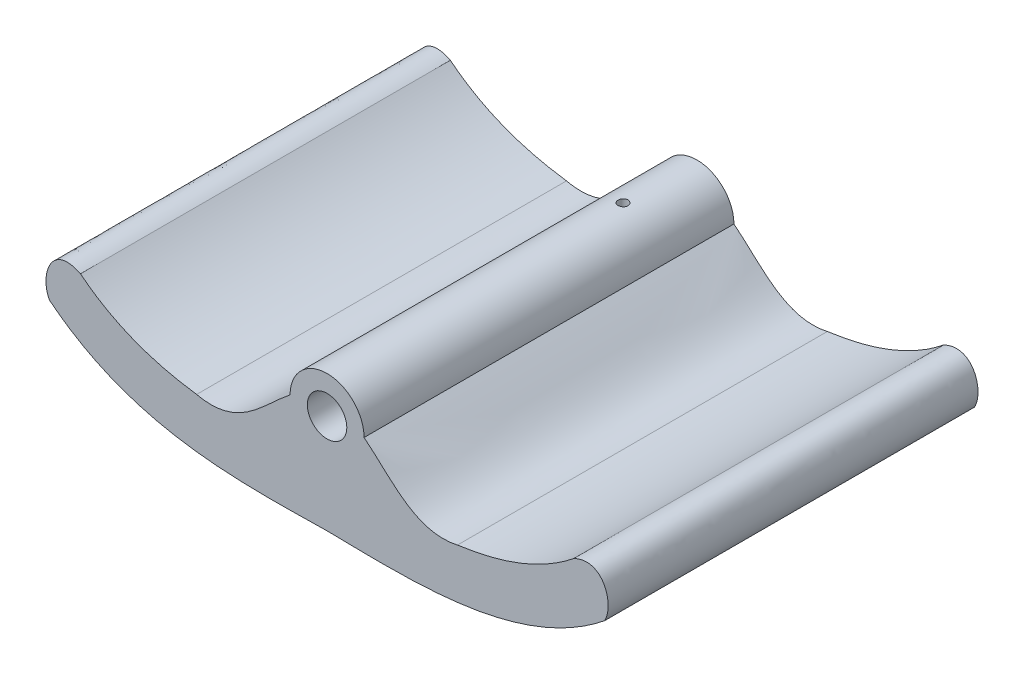
ISO-10303-21;
HEADER;
FILE_DESCRIPTION(('STEP AP214'),'2;1');
FILE_NAME('part.step','',(''),(''),'','','');
FILE_SCHEMA(('AUTOMOTIVE_DESIGN { 1 0 10303 214 1 1 1 1 }'));
ENDSEC;
DATA;
#1=APPLICATION_CONTEXT('core data for automotive mechanical design processes');
#2=APPLICATION_PROTOCOL_DEFINITION('international standard','automotive_design',2000,#1);
#3=PRODUCT_CONTEXT('',#1,'mechanical');
#4=PRODUCT('Part','Part','',(#3));
#5=PRODUCT_RELATED_PRODUCT_CATEGORY('part','',(#4));
#6=PRODUCT_DEFINITION_FORMATION('','',#4);
#7=PRODUCT_DEFINITION_CONTEXT('part definition',#1,'design');
#8=PRODUCT_DEFINITION('design','',#6,#7);
#9=PRODUCT_DEFINITION_SHAPE('','',#8);
#10=(LENGTH_UNIT() NAMED_UNIT(*) SI_UNIT(.MILLI.,.METRE.));
#11=(NAMED_UNIT(*) PLANE_ANGLE_UNIT() SI_UNIT($,.RADIAN.));
#12=(NAMED_UNIT(*) SI_UNIT($,.STERADIAN.) SOLID_ANGLE_UNIT());
#13=UNCERTAINTY_MEASURE_WITH_UNIT(LENGTH_MEASURE(1.E-05),#10,'distance_accuracy_value','');
#14=(GEOMETRIC_REPRESENTATION_CONTEXT(3) GLOBAL_UNCERTAINTY_ASSIGNED_CONTEXT((#13)) GLOBAL_UNIT_ASSIGNED_CONTEXT((#10,
#11,#12)) REPRESENTATION_CONTEXT('',''));
#15=CARTESIAN_POINT('',(0.,0.,0.));
#16=DIRECTION('',(0.,0.,1.));
#17=DIRECTION('',(1.,0.,0.));
#18=AXIS2_PLACEMENT_3D('',#15,#16,#17);
#19=CARTESIAN_POINT('',(0.,0.,75.));
#20=DIRECTION('',(0.,0.,-1.));
#21=DIRECTION('',(-1.,0.,0.));
#22=AXIS2_PLACEMENT_3D('',#19,#20,#21);
#23=CYLINDRICAL_SURFACE('',#22,7.5);
#24=CARTESIAN_POINT('',(0.,0.,0.));
#25=DIRECTION('',(0.,0.,1.));
#26=DIRECTION('',(1.,0.,0.));
#27=AXIS2_PLACEMENT_3D('',#24,#25,#26);
#28=CIRCLE('',#27,7.5);
#29=CARTESIAN_POINT('',(7.5,0.,0.));
#30=VERTEX_POINT('',#29);
#31=CARTESIAN_POINT('',(-7.5,0.,0.));
#32=VERTEX_POINT('',#31);
#33=EDGE_CURVE('E97',#30,#32,#28,.T.);
#34=ORIENTED_EDGE('',*,*,#33,.T.);
#35=DIRECTION('',(0.,0.,-1.));
#36=VECTOR('',#35,1.);
#37=CARTESIAN_POINT('',(-7.5,0.,75.));
#38=LINE('',#37,#36);
#39=CARTESIAN_POINT('',(-7.5,0.,75.));
#40=VERTEX_POINT('',#39);
#41=EDGE_CURVE('E260',#40,#32,#38,.T.);
#42=ORIENTED_EDGE('',*,*,#41,.F.);
#43=CARTESIAN_POINT('',(0.,0.,75.));
#44=DIRECTION('',(0.,0.,1.));
#45=DIRECTION('',(1.,0.,0.));
#46=AXIS2_PLACEMENT_3D('',#43,#44,#45);
#47=CIRCLE('',#46,7.5);
#48=CARTESIAN_POINT('',(7.5,0.,75.));
#49=VERTEX_POINT('',#48);
#50=EDGE_CURVE('E63',#49,#40,#47,.T.);
#51=ORIENTED_EDGE('',*,*,#50,.F.);
#52=DIRECTION('',(0.,0.,-1.));
#53=VECTOR('',#52,1.);
#54=CARTESIAN_POINT('',(7.5,0.,75.));
#55=LINE('',#54,#53);
#56=EDGE_CURVE('E94',#49,#30,#55,.T.);
#57=ORIENTED_EDGE('',*,*,#56,.T.);
#58=EDGE_LOOP('',(#34,#42,#51,#57));
#59=FACE_BOUND('',#58,.T.);
#60=CARTESIAN_POINT('',(0.,7.5,14.));
#61=CARTESIAN_POINT('',(-0.0559044178346404,7.49999917871272,14.0000023548535));
#62=CARTESIAN_POINT('',(-0.111842989638138,7.49936835363597,14.0047037689812));
#63=CARTESIAN_POINT('',(-0.222161362569038,7.49691255563452,14.0233831745248));
#64=CARTESIAN_POINT('',(-0.276539511166517,7.49508636220862,14.0373706474486));
#65=CARTESIAN_POINT('',(-0.38212415631349,7.49044539924533,14.0742008587707));
#66=CARTESIAN_POINT('',(-0.433332841529245,7.48763132105486,14.0970374055192));
#67=CARTESIAN_POINT('',(-0.531181947515148,7.48132693330196,14.1509034569031));
#68=CARTESIAN_POINT('',(-0.577823103168511,7.47783673279283,14.1819316405832));
#69=CARTESIAN_POINT('',(-0.665512911252337,7.47054497394982,14.2515066308021));
#70=CARTESIAN_POINT('',(-0.70652899274793,7.46674179081055,14.2900943225042));
#71=CARTESIAN_POINT('',(-0.781523678365507,7.45926568778975,14.3736050945383));
#72=CARTESIAN_POINT('',(-0.815501909986105,7.45559277481171,14.4185285099979));
#73=CARTESIAN_POINT('',(-0.875579511344536,7.44877717720095,14.5136495614725));
#74=CARTESIAN_POINT('',(-0.901648037412888,7.44563658882881,14.5638668412393));
#75=CARTESIAN_POINT('',(-0.944969225036449,7.44026293689616,14.6680155336184));
#76=CARTESIAN_POINT('',(-0.962222266226388,7.43802983425604,14.7219467861767));
#77=CARTESIAN_POINT('',(-0.987323033860868,7.43473968284334,14.8316529052508));
#78=CARTESIAN_POINT('',(-0.995226021142531,7.43367572685068,14.8874149172665));
#79=CARTESIAN_POINT('',(-1.00157340274058,7.43282325804657,14.999483089803));
#80=CARTESIAN_POINT('',(-1.000018228168,7.433034687102,15.0557892254054));
#81=CARTESIAN_POINT('',(-0.987538729696171,7.43470277886495,15.166960565014));
#82=CARTESIAN_POINT('',(-0.976675487658807,7.43615132311171,15.2218327649429));
#83=CARTESIAN_POINT('',(-0.945983623171856,7.44011776387373,15.32896841838));
#84=CARTESIAN_POINT('',(-0.926154796307285,7.44263568477064,15.3812318123775));
#85=CARTESIAN_POINT('',(-0.878029645715954,7.44846630555513,15.4818548173536));
#86=CARTESIAN_POINT('',(-0.849706989568744,7.45178147061949,15.5302016855972));
#87=CARTESIAN_POINT('',(-0.785416966721444,7.45883118109967,15.6214795409588));
#88=CARTESIAN_POINT('',(-0.749449202511923,7.46256574831765,15.6644102462771));
#89=CARTESIAN_POINT('',(-0.67055245013181,7.47006949616793,15.7439915062909));
#90=CARTESIAN_POINT('',(-0.62757085351322,7.47383871770599,15.7805899213512));
#91=CARTESIAN_POINT('',(-0.536047085066701,7.48095961909132,15.8460610224642));
#92=CARTESIAN_POINT('',(-0.487504897221182,7.48431129773577,15.8749336862618));
#93=CARTESIAN_POINT('',(-0.386196109865233,7.4902219687179,15.9241345588474));
#94=CARTESIAN_POINT('',(-0.333427789420613,7.49278063604478,15.9444592655232));
#95=CARTESIAN_POINT('',(-0.225185462168122,7.49681412952036,15.9759446594862));
#96=CARTESIAN_POINT('',(-0.169711599771125,7.49828901344964,15.9871058353197));
#97=CARTESIAN_POINT('',(-0.0580834516628186,7.49998120688428,15.9998792163856));
#98=CARTESIAN_POINT('',(-0.00193751727351819,7.50020796924523,16.0015632008917));
#99=CARTESIAN_POINT('',(0.109835808609361,7.49940395769259,15.9955241679364));
#100=CARTESIAN_POINT('',(0.165463212672835,7.49837321434299,15.9878013791088));
#101=CARTESIAN_POINT('',(0.274406857786472,7.4951758767905,15.963227673308));
#102=CARTESIAN_POINT('',(0.327731008256025,7.49301357151461,15.9464112158389));
#103=CARTESIAN_POINT('',(0.430802549396783,7.48779504627144,15.9041635170315));
#104=CARTESIAN_POINT('',(0.480549803507822,7.4847387921972,15.8787319469934));
#105=CARTESIAN_POINT('',(0.575374439308042,7.47804918685037,15.8198039222083));
#106=CARTESIAN_POINT('',(0.620422907198305,7.47441257522858,15.7862613171433));
#107=CARTESIAN_POINT('',(0.704276473495951,7.46697864354991,15.7121283353879));
#108=CARTESIAN_POINT('',(0.743081288311895,7.4631813162031,15.6715376387418));
#109=CARTESIAN_POINT('',(0.813602747115493,7.45582451236755,15.5841434286802));
#110=CARTESIAN_POINT('',(0.845271638044694,7.45226674387649,15.5373012166309));
#111=CARTESIAN_POINT('',(0.900291755394072,7.44582066500908,15.4389202948595));
#112=CARTESIAN_POINT('',(0.923643167551735,7.44293233968392,15.3873816900448));
#113=CARTESIAN_POINT('',(0.961289182503733,7.43816405890039,15.2812213789862));
#114=CARTESIAN_POINT('',(0.975610144233979,7.43628117116299,15.2266091573946));
#115=CARTESIAN_POINT('',(0.994873335719796,7.43372874349146,15.1157281839356));
#116=CARTESIAN_POINT('',(0.999816067133911,7.43305913865671,15.0594595208378));
#117=CARTESIAN_POINT('',(1.00017242903095,7.43301115647724,14.9473382545732));
#118=CARTESIAN_POINT('',(0.995661095972465,7.4336226114126,14.8914858795179));
#119=CARTESIAN_POINT('',(0.977396883433447,7.43604591937099,14.7813410624481));
#120=CARTESIAN_POINT('',(0.963644007416344,7.43785777194415,14.727048619849));
#121=CARTESIAN_POINT('',(0.927311551661037,7.44247445136382,14.6215781583742));
#122=CARTESIAN_POINT('',(0.904736104095207,7.445278813297,14.5703986944416));
#123=CARTESIAN_POINT('',(0.851406713798688,7.45156522856411,14.472542058087));
#124=CARTESIAN_POINT('',(0.820652613152144,7.45504729498301,14.425864972622));
#125=CARTESIAN_POINT('',(0.751562242547543,7.46232983591531,14.3379551750358));
#126=CARTESIAN_POINT('',(0.713170136134507,7.46613252877041,14.2967665261224));
#127=CARTESIAN_POINT('',(0.630010846749121,7.47360859500832,14.2213883918192));
#128=CARTESIAN_POINT('',(0.58524217036489,7.47728193784489,14.1872005506249));
#129=CARTESIAN_POINT('',(0.490376493926414,7.48410317568764,14.1266664307667));
#130=CARTESIAN_POINT('',(0.440257310371986,7.48724873213445,14.1003546667224));
#131=CARTESIAN_POINT('',(0.336296204793668,7.49263660329486,14.0565597007275));
#132=CARTESIAN_POINT('',(0.282458339484947,7.49487988462156,14.0390670456876));
#133=CARTESIAN_POINT('',(0.190294204049212,7.49767860871633,14.0175259968074));
#134=CARTESIAN_POINT('',(0.152545540977892,7.49854481817537,14.0109633782382));
#135=CARTESIAN_POINT('',(0.0765365858080579,7.49970579245385,14.0021995929173));
#136=CARTESIAN_POINT('',(0.0382762982256221,7.500000562314,13.9999983876932));
#137=CARTESIAN_POINT('',(0.,7.5,14.));
#138=B_SPLINE_CURVE_WITH_KNOTS('',3,(#60,#61,#62,#63,#64,#65,#66,#67,#68,#69,#70,#71,#72,#73,
#74,#75,#76,#77,#78,#79,#80,#81,#82,#83,#84,#85,#86,#87,#88,#89,#90,#91,#92,#93,#94,#95,#96,#97,
#98,#99,#100,#101,#102,#103,#104,#105,#106,#107,#108,#109,#110,#111,#112,#113,#114,#115,#116,
#117,#118,#119,#120,#121,#122,#123,#124,#125,#126,#127,#128,#129,#130,#131,#132,#133,#134,#135,
#136,#137),.UNSPECIFIED.,.T.,.F.,(4,2,2,2,2,2,2,2,2,2,2,2,2,2,2,2,2,2,2,2,2,2,2,2,2,2,2,2,2,2,2,
2,2,2,2,2,2,2,4),(0.,0.167573425652872,0.335318215442522,0.502945846413702,0.670546462820174,
0.839079892217795,1.00762223952418,1.17681360755824,1.34599768883102,1.51417677957179,
1.6823482046246,1.84942442549022,2.01650445587925,2.18410791568949,2.35172009221899,
2.52065272242425,2.68958583926148,2.85858810101269,3.02758135195872,3.19529292496031,
3.36300042177239,3.53007681698232,3.69715958751773,3.86521637384942,4.03328079129381,
4.20243852267725,4.37159247636524,4.54025037367727,4.70889924891817,4.87621463748312,
5.04352996334373,5.21076701851311,5.37800730297951,5.54651833917553,5.7150689062558,
5.88434763337258,6.05344452496209,6.16817869523654,6.28291185342719),.UNSPECIFIED.);
#139=CARTESIAN_POINT('',(0.,7.5,14.));
#140=VERTEX_POINT('',#139);
#141=EDGE_CURVE('E220',#140,#140,#138,.T.);
#142=ORIENTED_EDGE('',*,*,#141,.F.);
#143=EDGE_LOOP('',(#142));
#144=FACE_BOUND('',#143,.T.);
#145=ADVANCED_FACE('F39',(#59,#144),#23,.T.);
#146=CARTESIAN_POINT('',(0.,0.,75.));
#147=DIRECTION('',(0.,0.,-1.));
#148=DIRECTION('',(-1.,0.,0.));
#149=AXIS2_PLACEMENT_3D('',#146,#147,#148);
#150=CYLINDRICAL_SURFACE('',#149,4.);
#151=CARTESIAN_POINT('',(0.,0.,0.));
#152=DIRECTION('',(0.,0.,1.));
#153=DIRECTION('',(1.,0.,0.));
#154=AXIS2_PLACEMENT_3D('',#151,#152,#153);
#155=CIRCLE('',#154,4.);
#156=CARTESIAN_POINT('',(4.,0.,0.));
#157=VERTEX_POINT('',#156);
#158=EDGE_CURVE('E219',#157,#157,#155,.T.);
#159=ORIENTED_EDGE('',*,*,#158,.F.);
#160=EDGE_LOOP('',(#159));
#161=FACE_BOUND('',#160,.T.);
#162=CARTESIAN_POINT('',(0.,0.,75.));
#163=DIRECTION('',(0.,0.,1.));
#164=DIRECTION('',(1.,0.,0.));
#165=AXIS2_PLACEMENT_3D('',#162,#163,#164);
#166=CIRCLE('',#165,4.);
#167=CARTESIAN_POINT('',(4.,0.,75.));
#168=VERTEX_POINT('',#167);
#169=EDGE_CURVE('E144',#168,#168,#166,.T.);
#170=ORIENTED_EDGE('',*,*,#169,.T.);
#171=EDGE_LOOP('',(#170));
#172=FACE_BOUND('',#171,.T.);
#173=CARTESIAN_POINT('',(0.,4.,14.));
#174=CARTESIAN_POINT('',(-0.0552507257798188,3.99999906578675,14.0000015504921));
#175=CARTESIAN_POINT('',(-0.110518771887174,3.99884385421219,14.0045943671825));
#176=CARTESIAN_POINT('',(-0.219470882513687,3.99434742553261,14.022816767538));
#177=CARTESIAN_POINT('',(-0.273154031247158,3.99100496946646,14.0364514730252));
#178=CARTESIAN_POINT('',(-0.377347248121716,3.98250417554693,14.0722928356414));
#179=CARTESIAN_POINT('',(-0.427861042286667,3.97734801894725,14.0944891991435));
#180=CARTESIAN_POINT('',(-0.524448087936282,3.96576895871729,14.1467875933632));
#181=CARTESIAN_POINT('',(-0.570521189565838,3.95934601236034,14.176889890746));
#182=CARTESIAN_POINT('',(-0.657867951533945,3.94578275727868,14.2448005264361));
#183=CARTESIAN_POINT('',(-0.699037126707379,3.93863138099022,14.2827410499728));
#184=CARTESIAN_POINT('',(-0.774499284802201,3.92449080078353,14.3649681366059));
#185=CARTESIAN_POINT('',(-0.808791491299422,3.91750161525566,14.4092554152977));
#186=CARTESIAN_POINT('',(-0.870017695199354,3.9043651713314,14.5037301511583));
#187=CARTESIAN_POINT('',(-0.896834810616903,3.89823196313737,14.5539954872069));
#188=CARTESIAN_POINT('',(-0.941597939033684,3.88766329874815,14.6584989411056));
#189=CARTESIAN_POINT('',(-0.959545370292887,3.88322757115193,14.7127364222172));
#190=CARTESIAN_POINT('',(-0.985703224536192,3.87666984478367,14.8224956654683));
#191=CARTESIAN_POINT('',(-0.994101512222224,3.87450327383617,14.8779699306999));
#192=CARTESIAN_POINT('',(-1.00150785004523,3.87259575025161,14.9895790460093));
#193=CARTESIAN_POINT('',(-1.00051742787865,3.87285440299096,15.0457137871324));
#194=CARTESIAN_POINT('',(-0.989324349759519,3.87572803664412,15.1556105384963));
#195=CARTESIAN_POINT('',(-0.979345560127012,3.87828575334586,15.2093970809767));
#196=CARTESIAN_POINT('',(-0.950816124602069,3.88537806450989,15.3145073672742));
#197=CARTESIAN_POINT('',(-0.93226486804628,3.88991279980464,15.3658309353527));
#198=CARTESIAN_POINT('',(-0.886926318624768,3.90050075936124,15.4651586775014));
#199=CARTESIAN_POINT('',(-0.860057778155272,3.90656884979614,15.5131241145264));
#200=CARTESIAN_POINT('',(-0.798904184009968,3.91953140564257,15.6039458065046));
#201=CARTESIAN_POINT('',(-0.764617832539223,3.9264260155649,15.6468011653782));
#202=CARTESIAN_POINT('',(-0.688442283120809,3.94050587026521,15.7274690771296));
#203=CARTESIAN_POINT('',(-0.646364172110571,3.94769379651981,15.7651029933742));
#204=CARTESIAN_POINT('',(-0.556407945002465,3.96137310385857,15.8328141616426));
#205=CARTESIAN_POINT('',(-0.508529651805294,3.96786446366277,15.8628911828424));
#206=CARTESIAN_POINT('',(-0.408077259120926,3.97945154729455,15.9147003908163));
#207=CARTESIAN_POINT('',(-0.355487595472414,3.9845424008515,15.9364035601696));
#208=CARTESIAN_POINT('',(-0.247250672095253,3.99271944660946,15.9706115371397));
#209=CARTESIAN_POINT('',(-0.191603999433655,3.99580602226187,15.9831181042788));
#210=CARTESIAN_POINT('',(-0.0803599802600162,3.9995699951425,15.9983050437059));
#211=CARTESIAN_POINT('',(-0.0247978133254714,4.00030702338852,16.0012286840502));
#212=CARTESIAN_POINT('',(0.0860219165343409,3.999458698763,15.9978339986297));
#213=CARTESIAN_POINT('',(0.141279506429732,3.99787355494564,15.9915165048006));
#214=CARTESIAN_POINT('',(0.24907617918433,3.99259720751571,15.9700193944057));
#215=CARTESIAN_POINT('',(0.301643412645838,3.98893756123874,15.9549724910153));
#216=CARTESIAN_POINT('',(0.403504861635009,3.97992471089423,15.9165952773144));
#217=CARTESIAN_POINT('',(0.452798746021759,3.97457133579928,15.8932641304579));
#218=CARTESIAN_POINT('',(0.547682089619902,3.96262205284207,15.8385092474168));
#219=CARTESIAN_POINT('',(0.593190294557224,3.95600578244621,15.8069492584022));
#220=CARTESIAN_POINT('',(0.678351075762167,3.94229672791613,15.7368067274687));
#221=CARTESIAN_POINT('',(0.718002639315342,3.93520386167803,15.6982229735887));
#222=CARTESIAN_POINT('',(0.791327045381822,3.92112637973847,15.6139986927704));
#223=CARTESIAN_POINT('',(0.824829245081356,3.91414869458187,15.5682081979984));
#224=CARTESIAN_POINT('',(0.8836738393418,3.90128585584826,15.4715115770229));
#225=CARTESIAN_POINT('',(0.909016596105293,3.89540065378017,15.4206056780268));
#226=CARTESIAN_POINT('',(0.950634280406197,3.88545396489777,15.3153961850579));
#227=CARTESIAN_POINT('',(0.966962931102712,3.88138170194604,15.2611149144373));
#228=CARTESIAN_POINT('',(0.990230439969188,3.87551162726789,15.1504602414073));
#229=CARTESIAN_POINT('',(0.99717135165244,3.87371331813291,15.0940872993117));
#230=CARTESIAN_POINT('',(1.00135906022266,3.87263267469304,14.9825859840965));
#231=CARTESIAN_POINT('',(0.99887859852008,3.87327955152176,14.9274683765835));
#232=CARTESIAN_POINT('',(0.984918185541913,3.87685272671895,14.8184640742213));
#233=CARTESIAN_POINT('',(0.973438415124514,3.87977897927904,14.7645773546576));
#234=CARTESIAN_POINT('',(0.941954212961864,3.88754173788482,14.6598610272897));
#235=CARTESIAN_POINT('',(0.922000936453585,3.89236676824206,14.6090151298399));
#236=CARTESIAN_POINT('',(0.874176609070049,3.90338503816552,14.5113564115242));
#237=CARTESIAN_POINT('',(0.846304460022794,3.90957846747182,14.4645441512087));
#238=CARTESIAN_POINT('',(0.782578499091426,3.92283756175675,14.3749635806653));
#239=CARTESIAN_POINT('',(0.746535441941505,3.92992176554505,14.3323326177174));
#240=CARTESIAN_POINT('',(0.667859580793159,3.94405351497524,14.2536353034697));
#241=CARTESIAN_POINT('',(0.625225214174099,3.95110105151373,14.217570513258));
#242=CARTESIAN_POINT('',(0.533645057801728,3.96451770431775,14.1523924609569));
#243=CARTESIAN_POINT('',(0.484598948210925,3.97087222243912,14.1234169242189));
#244=CARTESIAN_POINT('',(0.382177373006984,3.98203283316746,14.0741683580396));
#245=CARTESIAN_POINT('',(0.32880504229116,3.98684003466521,14.053889092901));
#246=CARTESIAN_POINT('',(0.229606835495648,3.99365373043694,14.0256187797802));
#247=CARTESIAN_POINT('',(0.184253447272046,3.9960172336846,14.016032504631));
#248=CARTESIAN_POINT('',(0.0926040476908566,3.99919070154632,14.003222704252));
#249=CARTESIAN_POINT('',(0.046308107495079,4.00000078300596,13.9999987004631));
#250=CARTESIAN_POINT('',(0.,4.,14.));
#251=B_SPLINE_CURVE_WITH_KNOTS('',3,(#173,#174,#175,#176,#177,#178,#179,#180,#181,#182,#183,
#184,#185,#186,#187,#188,#189,#190,#191,#192,#193,#194,#195,#196,#197,#198,#199,#200,#201,#202,
#203,#204,#205,#206,#207,#208,#209,#210,#211,#212,#213,#214,#215,#216,#217,#218,#219,#220,#221,
#222,#223,#224,#225,#226,#227,#228,#229,#230,#231,#232,#233,#234,#235,#236,#237,#238,#239,#240,
#241,#242,#243,#244,#245,#246,#247,#248,#249,#250),.UNSPECIFIED.,.T.,.F.,(4,2,2,2,2,2,2,2,2,2,2,
2,2,2,2,2,2,2,2,2,2,2,2,2,2,2,2,2,2,2,2,2,2,2,2,2,2,2,4),(0.,0.16558247498126,0.331258825175933,
0.49673660152407,0.662219960112885,0.830762902914261,0.999324863867079,1.17039098363871,
1.34142974112912,1.50904196732954,1.67662692075131,1.84014998004679,2.00368468977359,
2.16887018582586,2.33408460557442,2.50401000646013,2.67394059705498,2.84445486006076,
3.01493649125762,3.18105539299518,3.34715934075162,3.51080183009358,3.67446084881527,
3.84102391710235,4.0076157533868,4.17829672802984,4.34897012499672,4.51861503076025,
4.68822282168272,4.85295853599075,5.0176909397069,5.18144267039632,5.34521712091268,
5.51326384273274,5.68135046513612,5.85248123666392,6.02348909214234,6.16228161961433,
6.3010637069536),.UNSPECIFIED.);
#252=CARTESIAN_POINT('',(0.,4.,14.));
#253=VERTEX_POINT('',#252);
#254=EDGE_CURVE('E44',#253,#253,#251,.T.);
#255=ORIENTED_EDGE('',*,*,#254,.T.);
#256=EDGE_LOOP('',(#255));
#257=FACE_BOUND('',#256,.T.);
#258=ADVANCED_FACE('F240',(#161,#172,#257),#150,.F.);
#259=CARTESIAN_POINT('',(-7.5,0.,75.));
#260=CARTESIAN_POINT('',(-13.1334138185045,-4.46191243505371,75.));
#261=CARTESIAN_POINT('',(-17.7674419750409,-11.3459001920083,75.));
#262=CARTESIAN_POINT('',(-26.4484089845491,-9.40415069355727,75.));
#263=B_SPLINE_CURVE_WITH_KNOTS('',3,(#259,#260,#261,#262),.UNSPECIFIED.,.F.,.F.,(4,4),(0.,1.),.UNSPECIFIED.);
#264=DIRECTION('',(0.,0.,-1.));
#265=VECTOR('',#264,1.);
#266=SURFACE_OF_LINEAR_EXTRUSION('',#263,#265);
#267=CARTESIAN_POINT('',(-7.5,0.,0.));
#268=CARTESIAN_POINT('',(-13.1334138185045,-4.46191243505371,0.));
#269=CARTESIAN_POINT('',(-17.7674419750409,-11.3459001920083,0.));
#270=CARTESIAN_POINT('',(-26.4484089845491,-9.40415069355727,0.));
#271=B_SPLINE_CURVE_WITH_KNOTS('',3,(#267,#268,#269,#270),.UNSPECIFIED.,.F.,.F.,(4,4),(0.,1.),.UNSPECIFIED.);
#272=CARTESIAN_POINT('',(-26.4484089865976,-9.40415069327524,0.));
#273=VERTEX_POINT('',#272);
#274=EDGE_CURVE('E228',#32,#273,#271,.T.);
#275=ORIENTED_EDGE('',*,*,#274,.T.);
#276=DIRECTION('',(0.,0.,-1.));
#277=VECTOR('',#276,1.);
#278=CARTESIAN_POINT('',(-26.4484089865976,-9.40415069327524,75.));
#279=LINE('',#278,#277);
#280=CARTESIAN_POINT('',(-26.4484089865976,-9.40415069327524,75.));
#281=VERTEX_POINT('',#280);
#282=EDGE_CURVE('E11',#281,#273,#279,.T.);
#283=ORIENTED_EDGE('',*,*,#282,.F.);
#284=EDGE_CURVE('E211',#40,#281,#263,.T.);
#285=ORIENTED_EDGE('',*,*,#284,.F.);
#286=ORIENTED_EDGE('',*,*,#41,.T.);
#287=EDGE_LOOP('',(#275,#283,#285,#286));
#288=FACE_BOUND('',#287,.T.);
#289=ADVANCED_FACE('F41',(#288),#266,.F.);
#290=CARTESIAN_POINT('',(0.,-10.1391304347826,75.));
#291=CARTESIAN_POINT('',(-16.9347363084666,-10.3875158979014,75.));
#292=CARTESIAN_POINT('',(-35.7540764487525,-11.4685207472791,75.));
#293=CARTESIAN_POINT('',(-50.,0.,75.));
#294=B_SPLINE_CURVE_WITH_KNOTS('',3,(#290,#291,#292,#293),.UNSPECIFIED.,.F.,.F.,(4,4),(0.,1.),.UNSPECIFIED.);
#295=DIRECTION('',(0.,0.,-1.));
#296=VECTOR('',#295,1.);
#297=SURFACE_OF_LINEAR_EXTRUSION('',#294,#296);
#298=CARTESIAN_POINT('',(0.,-10.1391304347826,0.));
#299=CARTESIAN_POINT('',(-16.9347363084666,-10.3875158979014,0.));
#300=CARTESIAN_POINT('',(-35.7540764487525,-11.4685207472791,0.));
#301=CARTESIAN_POINT('',(-50.,0.,0.));
#302=B_SPLINE_CURVE_WITH_KNOTS('',3,(#298,#299,#300,#301),.UNSPECIFIED.,.F.,.F.,(4,4),(0.,1.),.UNSPECIFIED.);
#303=CARTESIAN_POINT('',(-50.,0.,0.));
#304=VERTEX_POINT('',#303);
#305=EDGE_CURVE('E267',#273,#304,#302,.T.);
#306=ORIENTED_EDGE('',*,*,#305,.T.);
#307=DIRECTION('',(0.,0.,-1.));
#308=VECTOR('',#307,1.);
#309=CARTESIAN_POINT('',(-50.,0.,75.));
#310=LINE('',#309,#308);
#311=CARTESIAN_POINT('',(-50.,0.,75.));
#312=VERTEX_POINT('',#311);
#313=EDGE_CURVE('E55',#312,#304,#310,.T.);
#314=ORIENTED_EDGE('',*,*,#313,.F.);
#315=EDGE_CURVE('E105',#281,#312,#294,.T.);
#316=ORIENTED_EDGE('',*,*,#315,.F.);
#317=ORIENTED_EDGE('',*,*,#282,.T.);
#318=EDGE_LOOP('',(#306,#314,#316,#317));
#319=FACE_BOUND('',#318,.T.);
#320=ADVANCED_FACE('F205',(#319),#297,.F.);
#321=CARTESIAN_POINT('',(-56.270853764275,-7.78950531594133,75.));
#322=CARTESIAN_POINT('',(-58.3170340171439,-4.12067293496329,75.));
#323=CARTESIAN_POINT('',(-55.9635160821954,2.95658676825881,75.));
#324=CARTESIAN_POINT('',(-50.,0.,75.));
#325=B_SPLINE_CURVE_WITH_KNOTS('',3,(#321,#322,#323,#324),.UNSPECIFIED.,.F.,.F.,(4,4),(0.,1.),.UNSPECIFIED.);
#326=DIRECTION('',(0.,0.,-1.));
#327=VECTOR('',#326,1.);
#328=SURFACE_OF_LINEAR_EXTRUSION('',#325,#327);
#329=CARTESIAN_POINT('',(-56.270853764275,-7.78950531594133,0.));
#330=CARTESIAN_POINT('',(-58.3170340171439,-4.12067293496329,0.));
#331=CARTESIAN_POINT('',(-55.9635160821954,2.95658676825881,0.));
#332=CARTESIAN_POINT('',(-50.,0.,0.));
#333=B_SPLINE_CURVE_WITH_KNOTS('',3,(#329,#330,#331,#332),.UNSPECIFIED.,.F.,.F.,(4,4),(0.,1.),.UNSPECIFIED.);
#334=CARTESIAN_POINT('',(-56.270853764275,-7.78950531594133,0.));
#335=VERTEX_POINT('',#334);
#336=EDGE_CURVE('E275',#335,#304,#333,.T.);
#337=ORIENTED_EDGE('',*,*,#336,.F.);
#338=DIRECTION('',(0.,0.,-1.));
#339=VECTOR('',#338,1.);
#340=CARTESIAN_POINT('',(-56.270853764275,-7.78950531594133,75.));
#341=LINE('',#340,#339);
#342=CARTESIAN_POINT('',(-56.270853764275,-7.78950531594133,75.));
#343=VERTEX_POINT('',#342);
#344=EDGE_CURVE('E331',#343,#335,#341,.T.);
#345=ORIENTED_EDGE('',*,*,#344,.F.);
#346=EDGE_CURVE('E191',#343,#312,#325,.T.);
#347=ORIENTED_EDGE('',*,*,#346,.T.);
#348=ORIENTED_EDGE('',*,*,#313,.T.);
#349=EDGE_LOOP('',(#337,#345,#347,#348));
#350=FACE_BOUND('',#349,.T.);
#351=ADVANCED_FACE('F202',(#350),#328,.T.);
#352=CARTESIAN_POINT('',(0.146656402356164,-20.138054971934,75.));
#353=CARTESIAN_POINT('',(-0.90916477632195,-20.153540930951,75.));
#354=CARTESIAN_POINT('',(-2.99709206799544,-20.1903779271954,75.));
#355=CARTESIAN_POINT('',(-7.36189809774652,-20.2663118164919,75.));
#356=CARTESIAN_POINT('',(-13.006626751151,-20.3134769440652,75.));
#357=CARTESIAN_POINT('',(-20.0511088344914,-20.1209552076309,75.));
#358=CARTESIAN_POINT('',(-27.2910309510082,-19.4872913753664,75.));
#359=CARTESIAN_POINT('',(-34.6643727382747,-18.1972375213493,75.));
#360=CARTESIAN_POINT('',(-42.0772148448691,-16.015044343603,75.));
#361=CARTESIAN_POINT('',(-48.1729927043026,-13.2424247804897,75.));
#362=CARTESIAN_POINT('',(-52.8715861868849,-10.3670331493996,75.));
#363=CARTESIAN_POINT('',(-55.1704357237866,-8.67538449973887,75.));
#364=CARTESIAN_POINT('',(-56.270853764275,-7.78950531594133,75.));
#365=B_SPLINE_CURVE_WITH_KNOTS('',3,(#352,#353,#354,#355,#356,#357,#358,#359,#360,#361,#362,
#363,#364),.UNSPECIFIED.,.F.,.F.,(4,1,1,1,1,1,1,1,1,1,4),(0.,0.0625,0.125,0.25,0.375,0.5,0.625,
0.75,0.875,0.9375,1.),.UNSPECIFIED.);
#366=DIRECTION('',(0.,0.,-1.));
#367=VECTOR('',#366,1.);
#368=SURFACE_OF_LINEAR_EXTRUSION('',#365,#367);
#369=CARTESIAN_POINT('',(0.146656402356164,-20.138054971934,0.));
#370=CARTESIAN_POINT('',(-0.90916477632195,-20.153540930951,0.));
#371=CARTESIAN_POINT('',(-2.99709206799544,-20.1903779271954,0.));
#372=CARTESIAN_POINT('',(-7.36189809774652,-20.2663118164919,0.));
#373=CARTESIAN_POINT('',(-13.006626751151,-20.3134769440652,0.));
#374=CARTESIAN_POINT('',(-20.0511088344914,-20.1209552076309,0.));
#375=CARTESIAN_POINT('',(-27.2910309510082,-19.4872913753664,0.));
#376=CARTESIAN_POINT('',(-34.6643727382747,-18.1972375213493,0.));
#377=CARTESIAN_POINT('',(-42.0772148448691,-16.015044343603,0.));
#378=CARTESIAN_POINT('',(-48.1729927043026,-13.2424247804897,0.));
#379=CARTESIAN_POINT('',(-52.8715861868849,-10.3670331493996,0.));
#380=CARTESIAN_POINT('',(-55.1704357237866,-8.67538449973887,0.));
#381=CARTESIAN_POINT('',(-56.270853764275,-7.78950531594133,0.));
#382=B_SPLINE_CURVE_WITH_KNOTS('',3,(#369,#370,#371,#372,#373,#374,#375,#376,#377,#378,#379,
#380,#381),.UNSPECIFIED.,.F.,.F.,(4,1,1,1,1,1,1,1,1,1,4),(0.,0.0625,0.125,0.25,0.375,0.5,0.625,
0.75,0.875,0.9375,1.),.UNSPECIFIED.);
#383=CARTESIAN_POINT('',(9.67051247226561E-08,-20.1402256951565,0.));
#384=VERTEX_POINT('',#383);
#385=EDGE_CURVE('E283',#384,#335,#382,.T.);
#386=ORIENTED_EDGE('',*,*,#385,.F.);
#387=DIRECTION('',(0.,0.,-1.));
#388=VECTOR('',#387,1.);
#389=CARTESIAN_POINT('',(9.67051247226561E-08,-20.1402256951565,75.));
#390=LINE('',#389,#388);
#391=CARTESIAN_POINT('',(9.67051247226561E-08,-20.1402256951565,75.));
#392=VERTEX_POINT('',#391);
#393=EDGE_CURVE('E329',#392,#384,#390,.T.);
#394=ORIENTED_EDGE('',*,*,#393,.F.);
#395=EDGE_CURVE('E182',#392,#343,#365,.T.);
#396=ORIENTED_EDGE('',*,*,#395,.T.);
#397=ORIENTED_EDGE('',*,*,#344,.T.);
#398=EDGE_LOOP('',(#386,#394,#396,#397));
#399=FACE_BOUND('',#398,.T.);
#400=ADVANCED_FACE('F199',(#399),#368,.T.);
#401=CARTESIAN_POINT('',(-0.146656402356164,-20.138054971934,75.));
#402=CARTESIAN_POINT('',(0.90916477632195,-20.153540930951,75.));
#403=CARTESIAN_POINT('',(2.99709206799544,-20.1903779271953,75.));
#404=CARTESIAN_POINT('',(7.36189809774652,-20.2663118164918,75.));
#405=CARTESIAN_POINT('',(13.0066267511509,-20.3134769440651,75.));
#406=CARTESIAN_POINT('',(20.0511088344914,-20.1209552076309,75.));
#407=CARTESIAN_POINT('',(27.2910309510082,-19.4872913753664,75.));
#408=CARTESIAN_POINT('',(34.6643727382748,-18.1972375213493,75.));
#409=CARTESIAN_POINT('',(42.0772148448691,-16.015044343603,75.));
#410=CARTESIAN_POINT('',(48.1729927043026,-13.2424247804897,75.));
#411=CARTESIAN_POINT('',(52.8715861868849,-10.3670331493996,75.));
#412=CARTESIAN_POINT('',(55.1704357237866,-8.67538449973885,75.));
#413=CARTESIAN_POINT('',(56.270853764275,-7.78950531594132,75.));
#414=B_SPLINE_CURVE_WITH_KNOTS('',3,(#401,#402,#403,#404,#405,#406,#407,#408,#409,#410,#411,
#412,#413),.UNSPECIFIED.,.F.,.F.,(4,1,1,1,1,1,1,1,1,1,4),(0.,0.0625,0.125,0.25,0.375,0.5,0.625,
0.75,0.875,0.9375,1.),.UNSPECIFIED.);
#415=DIRECTION('',(0.,0.,-1.));
#416=VECTOR('',#415,1.);
#417=SURFACE_OF_LINEAR_EXTRUSION('',#414,#416);
#418=CARTESIAN_POINT('',(-0.146656402356164,-20.138054971934,0.));
#419=CARTESIAN_POINT('',(0.90916477632195,-20.153540930951,0.));
#420=CARTESIAN_POINT('',(2.99709206799544,-20.1903779271953,0.));
#421=CARTESIAN_POINT('',(7.36189809774652,-20.2663118164918,0.));
#422=CARTESIAN_POINT('',(13.0066267511509,-20.3134769440651,0.));
#423=CARTESIAN_POINT('',(20.0511088344914,-20.1209552076309,0.));
#424=CARTESIAN_POINT('',(27.2910309510082,-19.4872913753664,0.));
#425=CARTESIAN_POINT('',(34.6643727382748,-18.1972375213493,0.));
#426=CARTESIAN_POINT('',(42.0772148448691,-16.015044343603,0.));
#427=CARTESIAN_POINT('',(48.1729927043026,-13.2424247804897,0.));
#428=CARTESIAN_POINT('',(52.8715861868849,-10.3670331493996,0.));
#429=CARTESIAN_POINT('',(55.1704357237866,-8.67538449973885,0.));
#430=CARTESIAN_POINT('',(56.270853764275,-7.78950531594132,0.));
#431=B_SPLINE_CURVE_WITH_KNOTS('',3,(#418,#419,#420,#421,#422,#423,#424,#425,#426,#427,#428,
#429,#430),.UNSPECIFIED.,.F.,.F.,(4,1,1,1,1,1,1,1,1,1,4),(0.,0.0625,0.125,0.25,0.375,0.5,0.625,
0.75,0.875,0.9375,1.),.UNSPECIFIED.);
#432=CARTESIAN_POINT('',(56.270853764275,-7.78950531594132,0.));
#433=VERTEX_POINT('',#432);
#434=EDGE_CURVE('E291',#384,#433,#431,.T.);
#435=ORIENTED_EDGE('',*,*,#434,.T.);
#436=DIRECTION('',(0.,0.,-1.));
#437=VECTOR('',#436,1.);
#438=CARTESIAN_POINT('',(56.270853764275,-7.78950531594132,75.));
#439=LINE('',#438,#437);
#440=CARTESIAN_POINT('',(56.270853764275,-7.78950531594132,75.));
#441=VERTEX_POINT('',#440);
#442=EDGE_CURVE('E326',#441,#433,#439,.T.);
#443=ORIENTED_EDGE('',*,*,#442,.F.);
#444=EDGE_CURVE('E174',#392,#441,#414,.T.);
#445=ORIENTED_EDGE('',*,*,#444,.F.);
#446=ORIENTED_EDGE('',*,*,#393,.T.);
#447=EDGE_LOOP('',(#435,#443,#445,#446));
#448=FACE_BOUND('',#447,.T.);
#449=ADVANCED_FACE('F167',(#448),#417,.F.);
#450=CARTESIAN_POINT('',(56.270853764275,-7.78950531594132,75.));
#451=CARTESIAN_POINT('',(58.3170340171439,-4.12067293496328,75.));
#452=CARTESIAN_POINT('',(55.9635160821953,2.95658676825881,75.));
#453=CARTESIAN_POINT('',(50.,0.,75.));
#454=B_SPLINE_CURVE_WITH_KNOTS('',3,(#450,#451,#452,#453),.UNSPECIFIED.,.F.,.F.,(4,4),(0.,1.),.UNSPECIFIED.);
#455=DIRECTION('',(0.,0.,-1.));
#456=VECTOR('',#455,1.);
#457=SURFACE_OF_LINEAR_EXTRUSION('',#454,#456);
#458=CARTESIAN_POINT('',(56.270853764275,-7.78950531594132,0.));
#459=CARTESIAN_POINT('',(58.3170340171439,-4.12067293496328,0.));
#460=CARTESIAN_POINT('',(55.9635160821953,2.95658676825881,0.));
#461=CARTESIAN_POINT('',(50.,0.,0.));
#462=B_SPLINE_CURVE_WITH_KNOTS('',3,(#458,#459,#460,#461),.UNSPECIFIED.,.F.,.F.,(4,4),(0.,1.),.UNSPECIFIED.);
#463=CARTESIAN_POINT('',(50.,0.,0.));
#464=VERTEX_POINT('',#463);
#465=EDGE_CURVE('E298',#433,#464,#462,.T.);
#466=ORIENTED_EDGE('',*,*,#465,.T.);
#467=DIRECTION('',(0.,0.,-1.));
#468=VECTOR('',#467,1.);
#469=CARTESIAN_POINT('',(50.,0.,75.));
#470=LINE('',#469,#468);
#471=CARTESIAN_POINT('',(50.,0.,75.));
#472=VERTEX_POINT('',#471);
#473=EDGE_CURVE('E133',#472,#464,#470,.T.);
#474=ORIENTED_EDGE('',*,*,#473,.F.);
#475=EDGE_CURVE('E139',#441,#472,#454,.T.);
#476=ORIENTED_EDGE('',*,*,#475,.F.);
#477=ORIENTED_EDGE('',*,*,#442,.T.);
#478=EDGE_LOOP('',(#466,#474,#476,#477));
#479=FACE_BOUND('',#478,.T.);
#480=ADVANCED_FACE('F164',(#479),#457,.F.);
#481=CARTESIAN_POINT('',(0.,-10.1391304347826,75.));
#482=CARTESIAN_POINT('',(16.9347363084666,-10.3875158979014,75.));
#483=CARTESIAN_POINT('',(35.7540764487525,-11.4685207472791,75.));
#484=CARTESIAN_POINT('',(50.,0.,75.));
#485=B_SPLINE_CURVE_WITH_KNOTS('',3,(#481,#482,#483,#484),.UNSPECIFIED.,.F.,.F.,(4,4),(0.,1.),.UNSPECIFIED.);
#486=DIRECTION('',(0.,0.,-1.));
#487=VECTOR('',#486,1.);
#488=SURFACE_OF_LINEAR_EXTRUSION('',#485,#487);
#489=CARTESIAN_POINT('',(0.,-10.1391304347826,0.));
#490=CARTESIAN_POINT('',(16.9347363084666,-10.3875158979014,0.));
#491=CARTESIAN_POINT('',(35.7540764487525,-11.4685207472791,0.));
#492=CARTESIAN_POINT('',(50.,0.,0.));
#493=B_SPLINE_CURVE_WITH_KNOTS('',3,(#489,#490,#491,#492),.UNSPECIFIED.,.F.,.F.,(4,4),(0.,1.),.UNSPECIFIED.);
#494=CARTESIAN_POINT('',(26.4484089865977,-9.40415069327523,0.));
#495=VERTEX_POINT('',#494);
#496=EDGE_CURVE('E128',#495,#464,#493,.T.);
#497=ORIENTED_EDGE('',*,*,#496,.F.);
#498=DIRECTION('',(0.,0.,-1.));
#499=VECTOR('',#498,1.);
#500=CARTESIAN_POINT('',(26.4484089865977,-9.40415069327523,75.));
#501=LINE('',#500,#499);
#502=CARTESIAN_POINT('',(26.4484089865977,-9.40415069327523,75.));
#503=VERTEX_POINT('',#502);
#504=EDGE_CURVE('E123',#503,#495,#501,.T.);
#505=ORIENTED_EDGE('',*,*,#504,.F.);
#506=EDGE_CURVE('E126',#503,#472,#485,.T.);
#507=ORIENTED_EDGE('',*,*,#506,.T.);
#508=ORIENTED_EDGE('',*,*,#473,.T.);
#509=EDGE_LOOP('',(#497,#505,#507,#508));
#510=FACE_BOUND('',#509,.T.);
#511=ADVANCED_FACE('F125',(#510),#488,.T.);
#512=CARTESIAN_POINT('',(7.5,0.,75.));
#513=CARTESIAN_POINT('',(13.1334138185045,-4.46191243505371,75.));
#514=CARTESIAN_POINT('',(17.7674419750409,-11.3459001920083,75.));
#515=CARTESIAN_POINT('',(26.4484089845491,-9.40415069355727,75.));
#516=B_SPLINE_CURVE_WITH_KNOTS('',3,(#512,#513,#514,#515),.UNSPECIFIED.,.F.,.F.,(4,4),(0.,1.),.UNSPECIFIED.);
#517=DIRECTION('',(0.,0.,-1.));
#518=VECTOR('',#517,1.);
#519=SURFACE_OF_LINEAR_EXTRUSION('',#516,#518);
#520=CARTESIAN_POINT('',(7.5,0.,0.));
#521=CARTESIAN_POINT('',(13.1334138185045,-4.46191243505371,0.));
#522=CARTESIAN_POINT('',(17.7674419750409,-11.3459001920083,0.));
#523=CARTESIAN_POINT('',(26.4484089845491,-9.40415069355727,0.));
#524=B_SPLINE_CURVE_WITH_KNOTS('',3,(#520,#521,#522,#523),.UNSPECIFIED.,.F.,.F.,(4,4),(0.,1.),.UNSPECIFIED.);
#525=EDGE_CURVE('E312',#30,#495,#524,.T.);
#526=ORIENTED_EDGE('',*,*,#525,.F.);
#527=ORIENTED_EDGE('',*,*,#56,.F.);
#528=EDGE_CURVE('E137',#49,#503,#516,.T.);
#529=ORIENTED_EDGE('',*,*,#528,.T.);
#530=ORIENTED_EDGE('',*,*,#504,.T.);
#531=EDGE_LOOP('',(#526,#527,#529,#530));
#532=FACE_BOUND('',#531,.T.);
#533=ADVANCED_FACE('F142',(#532),#519,.T.);
#534=CARTESIAN_POINT('',(0.,0.,75.));
#535=DIRECTION('',(0.,0.,1.));
#536=DIRECTION('',(1.,0.,0.));
#537=AXIS2_PLACEMENT_3D('',#534,#535,#536);
#538=PLANE('',#537);
#539=ORIENTED_EDGE('',*,*,#284,.T.);
#540=ORIENTED_EDGE('',*,*,#315,.T.);
#541=ORIENTED_EDGE('',*,*,#346,.F.);
#542=ORIENTED_EDGE('',*,*,#395,.F.);
#543=ORIENTED_EDGE('',*,*,#444,.T.);
#544=ORIENTED_EDGE('',*,*,#475,.T.);
#545=ORIENTED_EDGE('',*,*,#506,.F.);
#546=ORIENTED_EDGE('',*,*,#528,.F.);
#547=ORIENTED_EDGE('',*,*,#50,.T.);
#548=EDGE_LOOP('',(#539,#540,#541,#542,#543,#544,#545,#546,#547));
#549=FACE_BOUND('',#548,.T.);
#550=ORIENTED_EDGE('',*,*,#169,.F.);
#551=EDGE_LOOP('',(#550));
#552=FACE_BOUND('',#551,.T.);
#553=ADVANCED_FACE('F135',(#549,#552),#538,.T.);
#554=CARTESIAN_POINT('',(0.,0.,0.));
#555=DIRECTION('',(0.,0.,1.));
#556=DIRECTION('',(1.,0.,0.));
#557=AXIS2_PLACEMENT_3D('',#554,#555,#556);
#558=PLANE('',#557);
#559=ORIENTED_EDGE('',*,*,#274,.F.);
#560=ORIENTED_EDGE('',*,*,#33,.F.);
#561=ORIENTED_EDGE('',*,*,#525,.T.);
#562=ORIENTED_EDGE('',*,*,#496,.T.);
#563=ORIENTED_EDGE('',*,*,#465,.F.);
#564=ORIENTED_EDGE('',*,*,#434,.F.);
#565=ORIENTED_EDGE('',*,*,#385,.T.);
#566=ORIENTED_EDGE('',*,*,#336,.T.);
#567=ORIENTED_EDGE('',*,*,#305,.F.);
#568=EDGE_LOOP('',(#559,#560,#561,#562,#563,#564,#565,#566,#567));
#569=FACE_BOUND('',#568,.T.);
#570=ORIENTED_EDGE('',*,*,#158,.T.);
#571=EDGE_LOOP('',(#570));
#572=FACE_BOUND('',#571,.T.);
#573=ADVANCED_FACE('F233',(#569,#572),#558,.F.);
#574=CARTESIAN_POINT('',(0.,75.,15.));
#575=DIRECTION('',(0.,-1.,0.));
#576=DIRECTION('',(0.,0.,-1.));
#577=AXIS2_PLACEMENT_3D('',#574,#575,#576);
#578=CYLINDRICAL_SURFACE('',#577,1.);
#579=ORIENTED_EDGE('',*,*,#254,.F.);
#580=EDGE_LOOP('',(#579));
#581=FACE_BOUND('',#580,.T.);
#582=ORIENTED_EDGE('',*,*,#141,.T.);
#583=EDGE_LOOP('',(#582));
#584=FACE_BOUND('',#583,.T.);
#585=ADVANCED_FACE('F229',(#581,#584),#578,.F.);
#586=CLOSED_SHELL('',(#145,#258,#289,#320,#351,#400,#449,#480,#511,#533,#553,#573,#585));
#587=MANIFOLD_SOLID_BREP('B2',#586);
#588=ADVANCED_BREP_SHAPE_REPRESENTATION('',(#18,#587),#14);
#589=SHAPE_DEFINITION_REPRESENTATION(#9,#588);
ENDSEC;
END-ISO-10303-21;
